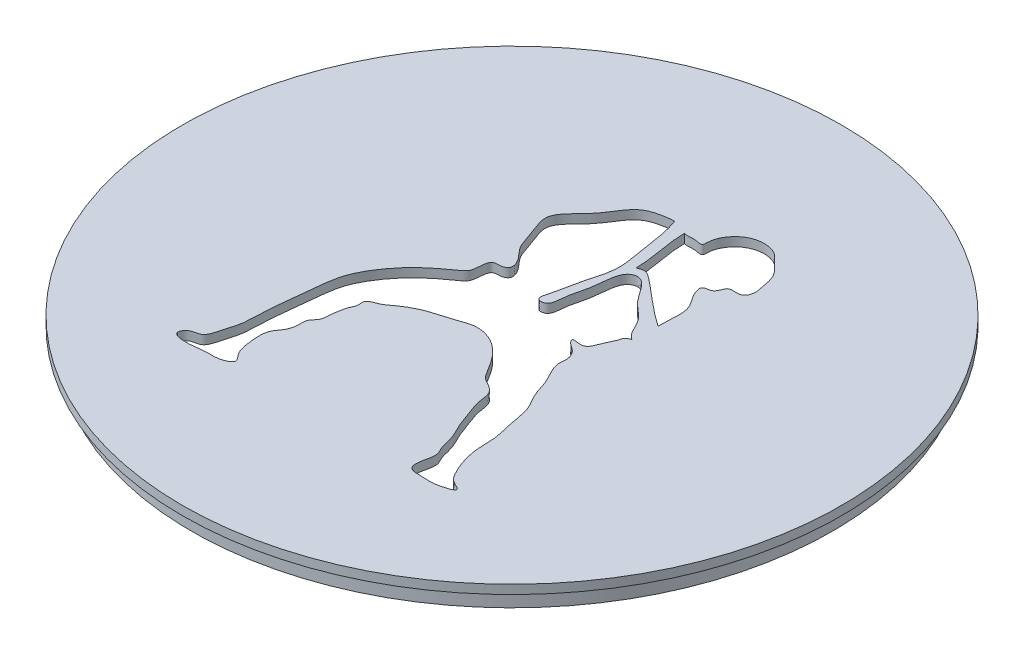
ISO-10303-21;
HEADER;
FILE_DESCRIPTION(('STEP AP214'),'2;1');
FILE_NAME('part.step','',(''),(''),'','','');
FILE_SCHEMA(('AUTOMOTIVE_DESIGN { 1 0 10303 214 1 1 1 1 }'));
ENDSEC;
DATA;
#1=APPLICATION_CONTEXT('core data for automotive mechanical design processes');
#2=APPLICATION_PROTOCOL_DEFINITION('international standard','automotive_design',2000,#1);
#3=PRODUCT_CONTEXT('',#1,'mechanical');
#4=PRODUCT('Part','Part','',(#3));
#5=PRODUCT_RELATED_PRODUCT_CATEGORY('part','',(#4));
#6=PRODUCT_DEFINITION_FORMATION('','',#4);
#7=PRODUCT_DEFINITION_CONTEXT('part definition',#1,'design');
#8=PRODUCT_DEFINITION('design','',#6,#7);
#9=PRODUCT_DEFINITION_SHAPE('','',#8);
#10=(LENGTH_UNIT() NAMED_UNIT(*) SI_UNIT(.MILLI.,.METRE.));
#11=(NAMED_UNIT(*) PLANE_ANGLE_UNIT() SI_UNIT($,.RADIAN.));
#12=(NAMED_UNIT(*) SI_UNIT($,.STERADIAN.) SOLID_ANGLE_UNIT());
#13=UNCERTAINTY_MEASURE_WITH_UNIT(LENGTH_MEASURE(1.E-05),#10,'distance_accuracy_value','');
#14=(GEOMETRIC_REPRESENTATION_CONTEXT(3) GLOBAL_UNCERTAINTY_ASSIGNED_CONTEXT((#13)) GLOBAL_UNIT_ASSIGNED_CONTEXT((#10,
#11,#12)) REPRESENTATION_CONTEXT('',''));
#15=CARTESIAN_POINT('',(0.,0.,0.));
#16=DIRECTION('',(0.,0.,1.));
#17=DIRECTION('',(1.,0.,0.));
#18=AXIS2_PLACEMENT_3D('',#15,#16,#17);
#19=CARTESIAN_POINT('',(35.,1.,-20.));
#20=DIRECTION('',(0.,-1.,0.));
#21=DIRECTION('',(0.,0.,-1.));
#22=AXIS2_PLACEMENT_3D('',#19,#20,#21);
#23=CYLINDRICAL_SURFACE('',#22,36.);
#24=CARTESIAN_POINT('',(35.,-2.,-20.));
#25=DIRECTION('',(0.,-1.,0.));
#26=DIRECTION('',(0.,0.,-1.));
#27=AXIS2_PLACEMENT_3D('',#24,#25,#26);
#28=CIRCLE('',#27,36.);
#29=CARTESIAN_POINT('',(35.,-2.,-56.));
#30=VERTEX_POINT('',#29);
#31=EDGE_CURVE('E93',#30,#30,#28,.T.);
#32=ORIENTED_EDGE('',*,*,#31,.F.);
#33=EDGE_LOOP('',(#32));
#34=FACE_BOUND('',#33,.T.);
#35=CARTESIAN_POINT('',(35.,0.,-20.));
#36=DIRECTION('',(0.,1.,0.));
#37=DIRECTION('',(0.,0.,1.));
#38=AXIS2_PLACEMENT_3D('',#35,#36,#37);
#39=CIRCLE('',#38,36.);
#40=CARTESIAN_POINT('',(35.,0.,16.));
#41=VERTEX_POINT('',#40);
#42=EDGE_CURVE('E11',#41,#41,#39,.T.);
#43=ORIENTED_EDGE('',*,*,#42,.F.);
#44=EDGE_LOOP('',(#43));
#45=FACE_BOUND('',#44,.T.);
#46=ADVANCED_FACE('F35',(#34,#45),#23,.T.);
#47=CARTESIAN_POINT('',(35.,0.,-20.));
#48=DIRECTION('',(0.,1.,0.));
#49=DIRECTION('',(0.,0.,1.));
#50=AXIS2_PLACEMENT_3D('',#47,#48,#49);
#51=PLANE('',#50);
#52=CARTESIAN_POINT('',(44.2684072218686,0.,-27.1376014509955));
#53=CARTESIAN_POINT('',(44.2533769701957,0.,-27.6533519739044));
#54=CARTESIAN_POINT('',(44.3415637822478,0.,-28.7380162958994));
#55=CARTESIAN_POINT('',(44.4370811389919,0.,-30.9929328559348));
#56=CARTESIAN_POINT('',(42.9768584395822,0.,-32.1663643897987));
#57=CARTESIAN_POINT('',(42.9123408622872,0.,-33.5384047598478));
#58=CARTESIAN_POINT('',(44.2570168843235,0.,-33.3685469718652));
#59=CARTESIAN_POINT('',(44.2788687764199,0.,-35.1618264145851));
#60=CARTESIAN_POINT('',(45.9428006665968,0.,-34.4996261485528));
#61=CARTESIAN_POINT('',(46.5366860307992,0.,-35.6809966284192));
#62=CARTESIAN_POINT('',(46.2732941288031,0.,-36.9630414381732));
#63=CARTESIAN_POINT('',(46.0009314383179,0.,-38.6354170478291));
#64=CARTESIAN_POINT('',(44.6920497916428,0.,-39.7356057286105));
#65=CARTESIAN_POINT('',(43.7915964612231,0.,-40.7944896880015));
#66=CARTESIAN_POINT('',(42.469955820955,0.,-41.2245196729233));
#67=CARTESIAN_POINT('',(41.0652192784521,0.,-41.0523551347629));
#68=CARTESIAN_POINT('',(39.8525616952295,0.,-40.2615959707708));
#69=CARTESIAN_POINT('',(39.1045097974421,0.,-39.1859639615422));
#70=CARTESIAN_POINT('',(38.8703827389554,0.,-38.3108620931466));
#71=CARTESIAN_POINT('',(38.9015647635665,0.,-37.3479483528773));
#72=CARTESIAN_POINT('',(37.8450244902051,0.,-37.7193780081381));
#73=CARTESIAN_POINT('',(37.1944804353436,0.,-37.5254301971895));
#74=CARTESIAN_POINT('',(36.8014674497458,0.,-37.6257686488056));
#75=CARTESIAN_POINT('',(36.7199381701414,0.,-37.6530722560517));
#76=B_SPLINE_CURVE_WITH_KNOTS('',3,(#52,#53,#54,#55,#56,#57,#58,#59,#60,#61,#62,#63,#64,#65,#66,
#67,#68,#69,#70,#71,#72,#73,#74,#75),.UNSPECIFIED.,.F.,.F.,(4,1,1,1,1,1,1,1,1,1,1,1,1,1,1,1,1,1,
1,1,1,4),(0.840261754562799,0.849614040426403,0.861989671805604,0.878687232952782,
0.879473272569278,0.885978907979521,0.893394390890591,0.902120846806361,0.907245198164805,
0.913938084328921,0.926247826115465,0.936822907601905,0.944331540495545,0.951416805850099,
0.96131279176228,0.969270836344137,0.977449048781423,0.984312844651854,0.986958297295132,
0.992067554802354,0.99835587173432,1.),.UNSPECIFIED.);
#77=CARTESIAN_POINT('',(44.2684072218686,0.,-27.1376014509955));
#78=VERTEX_POINT('',#77);
#79=CARTESIAN_POINT('',(36.7199381701414,0.,-37.6530722560517));
#80=VERTEX_POINT('',#79);
#81=EDGE_CURVE('E56',#78,#80,#76,.T.);
#82=ORIENTED_EDGE('',*,*,#81,.T.);
#83=CARTESIAN_POINT('',(36.7199381701414,0.,-37.6530722560517));
#84=CARTESIAN_POINT('',(36.7245709126911,0.,-35.4361929853331));
#85=CARTESIAN_POINT('',(37.3433949697957,0.,-33.9976339010875));
#86=CARTESIAN_POINT('',(37.3550791635603,0.,-31.5045272164468));
#87=CARTESIAN_POINT('',(37.85586392814,0.,-31.7858702006797));
#88=CARTESIAN_POINT('',(38.4397297089836,0.,-31.7648658024603));
#89=CARTESIAN_POINT('',(40.731795504975,0.,-29.9944883618215));
#90=CARTESIAN_POINT('',(42.3359800038837,0.,-28.4281882980386));
#91=CARTESIAN_POINT('',(44.2684072218686,0.,-27.1376014509955));
#92=B_SPLINE_CURVE_WITH_KNOTS('',3,(#83,#84,#85,#86,#87,#88,#89,#90,#91),.UNSPECIFIED.,.F.,.F.,
(4,1,1,1,1,1,4),(0.,0.408865467639292,0.417464776452159,0.441782685144361,0.484003627124166,
0.550110082068347,1.),.UNSPECIFIED.);
#93=EDGE_CURVE('E86',#80,#78,#92,.T.);
#94=ORIENTED_EDGE('',*,*,#93,.T.);
#95=EDGE_LOOP('',(#82,#94));
#96=FACE_BOUND('',#95,.T.);
#97=CARTESIAN_POINT('',(44.0945959688621,0.,-24.3747686748754));
#98=CARTESIAN_POINT('',(43.3402264316341,0.,-24.8219146313867));
#99=CARTESIAN_POINT('',(42.8794242997523,0.,-26.828060943173));
#100=CARTESIAN_POINT('',(40.3546147528533,0.,-28.1900739778941));
#101=CARTESIAN_POINT('',(39.089150894384,0.,-31.1742506440504));
#102=CARTESIAN_POINT('',(37.2865826762138,0.,-30.5025540707934));
#103=CARTESIAN_POINT('',(36.846057786281,0.,-28.9964151471788));
#104=CARTESIAN_POINT('',(36.8129174531688,0.,-26.9101642734574));
#105=CARTESIAN_POINT('',(36.1036963682116,0.,-25.0781606593259));
#106=CARTESIAN_POINT('',(36.1408081025084,0.,-22.9697175094246));
#107=CARTESIAN_POINT('',(34.6218540116167,0.,-22.916936972865));
#108=CARTESIAN_POINT('',(35.2499001639661,0.,-24.991471057335));
#109=CARTESIAN_POINT('',(35.5039554421292,0.,-27.1203239818772));
#110=CARTESIAN_POINT('',(36.6185353668157,0.,-30.1109769767712));
#111=CARTESIAN_POINT('',(35.8542596510925,0.,-33.9204569310826));
#112=CARTESIAN_POINT('',(35.646586984183,0.,-36.4947854128516));
#113=CARTESIAN_POINT('',(35.000000000006,0.,-38.2587399010213));
#114=B_SPLINE_CURVE_WITH_KNOTS('',3,(#97,#98,#99,#100,#101,#102,#103,#104,#105,#106,#107,#108,
#109,#110,#111,#112,#113),.UNSPECIFIED.,.F.,.F.,(4,1,1,1,1,1,1,1,1,1,1,1,1,1,4),(0.,
0.075653565265517,0.16329422090028,0.265408474211703,0.277383152405312,0.326761821228871,
0.388243326347542,0.467157234236005,0.516336115852378,0.534817749726603,0.570900710333995,
0.652929480321548,0.767428526514773,0.833043738036929,1.),.UNSPECIFIED.);
#115=CARTESIAN_POINT('',(44.0945959688621,0.,-24.3747686748754));
#116=VERTEX_POINT('',#115);
#117=CARTESIAN_POINT('',(35.000000000006,0.,-38.2587399010213));
#118=VERTEX_POINT('',#117);
#119=EDGE_CURVE('E126',#116,#118,#114,.T.);
#120=ORIENTED_EDGE('',*,*,#119,.T.);
#121=CARTESIAN_POINT('',(35.000000000006,0.,-38.2587399010213));
#122=CARTESIAN_POINT('',(34.6334103583951,0.,-38.2752923029345));
#123=CARTESIAN_POINT('',(33.648756906367,0.,-38.1295573479071));
#124=CARTESIAN_POINT('',(31.3040857680694,0.,-37.5388459223091));
#125=CARTESIAN_POINT('',(30.1168092688969,0.,-34.3356823666388));
#126=CARTESIAN_POINT('',(26.7641478812773,0.,-32.0070369936615));
#127=CARTESIAN_POINT('',(28.1551028871703,0.,-29.1290989436844));
#128=CARTESIAN_POINT('',(28.6711080022333,0.,-26.9260275864873));
#129=CARTESIAN_POINT('',(30.0293913679737,0.,-25.8493986237792));
#130=CARTESIAN_POINT('',(30.4315433907828,0.,-24.6148671822833));
#131=CARTESIAN_POINT('',(29.6974789151191,0.,-24.0406506953597));
#132=CARTESIAN_POINT('',(28.5878589531967,0.,-24.3063317553384));
#133=CARTESIAN_POINT('',(28.4125250510734,0.,-22.9719003172703));
#134=CARTESIAN_POINT('',(28.3998399106355,0.,-21.8818075734448));
#135=CARTESIAN_POINT('',(26.5228434376719,0.,-20.6029949131631));
#136=CARTESIAN_POINT('',(24.5961173362004,0.,-19.062333519027));
#137=CARTESIAN_POINT('',(22.8097129299006,0.,-16.6957572639246));
#138=CARTESIAN_POINT('',(21.5048500485635,0.,-14.2561700021504));
#139=CARTESIAN_POINT('',(21.2083673603225,0.,-10.6061532532267));
#140=CARTESIAN_POINT('',(20.7391210729927,0.,-7.25934436081872));
#141=CARTESIAN_POINT('',(20.7347679981921,0.,-4.86810811486501));
#142=CARTESIAN_POINT('',(20.580688090177,0.,-3.55055360393462));
#143=CARTESIAN_POINT('',(20.1334808303165,0.,-2.37115939707764));
#144=CARTESIAN_POINT('',(19.7677295689,0.,-0.471524993335283));
#145=CARTESIAN_POINT('',(18.3181570635214,0.,-0.587963471854365));
#146=CARTESIAN_POINT('',(17.5196591118911,0.,0.74708587412109));
#147=CARTESIAN_POINT('',(19.6799876776847,0.,1.06983585766343));
#148=CARTESIAN_POINT('',(21.2283417203665,0.,0.617763883262944));
#149=CARTESIAN_POINT('',(22.8241859250442,0.,0.854573911121346));
#150=CARTESIAN_POINT('',(24.2730653737471,0.,0.0435083743877694));
#151=CARTESIAN_POINT('',(23.1882123097544,0.,-0.968276034845709));
#152=CARTESIAN_POINT('',(22.9395017125131,0.,-2.19705456540007));
#153=CARTESIAN_POINT('',(22.7703002371806,0.,-3.5989998875785));
#154=CARTESIAN_POINT('',(22.8624733688003,0.,-4.92632394794915));
#155=CARTESIAN_POINT('',(23.7679535817603,0.,-5.87437036505003));
#156=CARTESIAN_POINT('',(24.0070936483419,0.,-6.97673916552015));
#157=CARTESIAN_POINT('',(23.8803953532202,0.,-8.08011903215776));
#158=CARTESIAN_POINT('',(24.8049662112702,0.,-8.77262340427504));
#159=CARTESIAN_POINT('',(24.7081291641603,0.,-9.96487245960174));
#160=CARTESIAN_POINT('',(24.9283486146205,0.,-10.8221740039716));
#161=CARTESIAN_POINT('',(25.0492370110219,0.,-11.6097466184251));
#162=CARTESIAN_POINT('',(25.5000157517144,0.,-12.1778815064506));
#163=CARTESIAN_POINT('',(25.1582963468325,0.,-13.2739339519208));
#164=CARTESIAN_POINT('',(26.5463756681205,0.,-13.5769471905162));
#165=CARTESIAN_POINT('',(27.6975313199085,0.,-14.5562087100063));
#166=CARTESIAN_POINT('',(29.6106864630498,0.,-15.6665111927504));
#167=CARTESIAN_POINT('',(31.8769497346245,0.,-16.1612360487609));
#168=CARTESIAN_POINT('',(33.779751425137,0.,-16.9574330121924));
#169=CARTESIAN_POINT('',(35.5585713484385,0.,-16.753562851689));
#170=CARTESIAN_POINT('',(37.2430979200246,0.,-15.767593916476));
#171=CARTESIAN_POINT('',(38.3849214634241,0.,-14.3125007306849));
#172=CARTESIAN_POINT('',(39.092400797911,0.,-13.0911013310902));
#173=CARTESIAN_POINT('',(39.6818316961198,0.,-12.2189743571604));
#174=CARTESIAN_POINT('',(40.5358620342724,0.,-11.8841742005808));
#175=CARTESIAN_POINT('',(41.4881113217759,0.,-11.0868510702231));
#176=CARTESIAN_POINT('',(41.4521641839507,0.,-9.61743324852769));
#177=CARTESIAN_POINT('',(42.1486098167388,0.,-8.1152379756008));
#178=CARTESIAN_POINT('',(42.6393221958368,0.,-6.37446575992144));
#179=CARTESIAN_POINT('',(43.6144604838174,0.,-4.8249813347122));
#180=CARTESIAN_POINT('',(43.7862517233169,0.,-3.34265073122424));
#181=CARTESIAN_POINT('',(44.5288338854425,0.,-2.12692196558256));
#182=CARTESIAN_POINT('',(44.048650315351,0.,-0.954303738814484));
#183=CARTESIAN_POINT('',(43.9937525050295,0.,0.795860267359707));
#184=CARTESIAN_POINT('',(45.8753560253886,0.,0.697141881002339));
#185=CARTESIAN_POINT('',(47.0220609593847,0.,0.898025913443454));
#186=CARTESIAN_POINT('',(49.5233883206855,0.,0.0919587022206106));
#187=CARTESIAN_POINT('',(47.8087624543954,0.,-0.46945567498224));
#188=CARTESIAN_POINT('',(47.1411710456176,0.,-1.46152557672172));
#189=CARTESIAN_POINT('',(46.4736206094042,0.,-2.95041370365713));
#190=CARTESIAN_POINT('',(45.9844959736973,0.,-4.88622300943797));
#191=CARTESIAN_POINT('',(46.1000321361512,0.,-7.09993219439433));
#192=CARTESIAN_POINT('',(45.38125872217,0.,-9.51548689862493));
#193=CARTESIAN_POINT('',(45.1607044707202,0.,-11.7784300300856));
#194=CARTESIAN_POINT('',(43.8776694352585,0.,-13.5823737353148));
#195=CARTESIAN_POINT('',(43.4996996922507,0.,-15.5132067410973));
#196=CARTESIAN_POINT('',(42.5302763924802,0.,-16.8477470700414));
#197=CARTESIAN_POINT('',(42.2526202926544,0.,-18.0366524337312));
#198=CARTESIAN_POINT('',(42.4960291373156,0.,-18.9403084643611));
#199=CARTESIAN_POINT('',(41.8851455209015,0.,-20.1104013563836));
#200=CARTESIAN_POINT('',(41.0352015397002,0.,-20.4225722705137));
#201=CARTESIAN_POINT('',(40.5805042436523,0.,-21.2424663322728));
#202=CARTESIAN_POINT('',(42.1781466815601,0.,-20.6639739461431));
#203=CARTESIAN_POINT('',(42.6572310391477,0.,-21.9008963847788));
#204=CARTESIAN_POINT('',(43.0112776119713,0.,-22.8055688452098));
#205=CARTESIAN_POINT('',(43.4042493033701,0.,-23.4715683537386));
#206=CARTESIAN_POINT('',(43.4739307960175,0.,-24.1735214405361));
#207=CARTESIAN_POINT('',(43.9372651647043,0.,-24.2794620400195));
#208=CARTESIAN_POINT('',(44.0945959688621,0.,-24.3747686748754));
#209=B_SPLINE_CURVE_WITH_KNOTS('',3,(#121,#122,#123,#124,#125,#126,#127,#128,#129,#130,#131,
#132,#133,#134,#135,#136,#137,#138,#139,#140,#141,#142,#143,#144,#145,#146,#147,#148,#149,#150,
#151,#152,#153,#154,#155,#156,#157,#158,#159,#160,#161,#162,#163,#164,#165,#166,#167,#168,#169,
#170,#171,#172,#173,#174,#175,#176,#177,#178,#179,#180,#181,#182,#183,#184,#185,#186,#187,#188,
#189,#190,#191,#192,#193,#194,#195,#196,#197,#198,#199,#200,#201,#202,#203,#204,#205,#206,#207,
#208),.UNSPECIFIED.,.F.,.F.,(4,1,1,1,1,1,1,1,1,1,1,1,1,1,1,1,1,1,1,1,1,1,1,1,1,1,1,1,1,1,1,1,1,
1,1,1,1,1,1,1,1,1,1,1,1,1,1,1,1,1,1,1,1,1,1,1,1,1,1,1,1,1,1,1,1,1,1,1,1,1,1,1,1,1,1,1,1,1,1,1,1,
1,1,1,1,4),(0.0111365318141637,0.0178945224331714,0.028840094658627,0.0535656406952058,
0.0763942975068769,0.0907824789208683,0.105824611112891,0.117198547687866,0.122579313700171,
0.125774424864193,0.132433961189153,0.138902274671442,0.145561810996402,0.152221347321363,
0.177469321740975,0.192360497662216,0.206081862640716,0.227670918744665,0.258486170551358,
0.268312899154322,0.271611104820945,0.282626245763527,0.293056087861728,0.300380672004226,
0.305512958211034,0.314184243058223,0.327371696046776,0.338888628983607,0.344534344162544,
0.349971310963932,0.35978828076642,0.368495546203212,0.375849975277582,0.383140358757306,
0.39148083635335,0.395962739615576,0.402399003646459,0.409753432720828,0.416280140492428,
0.41885768029041,0.424257140346201,0.428730315453577,0.436258060817448,0.443934884918196,
0.4580830691382,0.475465074628941,0.486740305280754,0.495169340304621,0.50730746498204,
0.521590357579405,0.528495312288299,0.533472975946526,0.540377930655419,0.544929056597164,
0.55530345416256,0.564763618049125,0.57546438064752,0.588352079637428,0.5976455315436,
0.602528071842045,0.613210558145976,0.620250037600372,0.628803340285457,0.639430809126769,
0.649602530831283,0.65545389054759,0.662581642785161,0.672715939123354,0.684786261536599,
0.699069154133964,0.712776808599336,0.73094908247305,0.739584236809564,0.752673529879548,
0.766303989723328,0.769155090618356,0.774753544475798,0.78293437890163,0.790233963276434,
0.791484253728353,0.7976412201643,0.805748850046419,0.812136353799026,0.816139236347283,
0.820033243830243,0.823536287348269),.UNSPECIFIED.);
#210=EDGE_CURVE('E134',#118,#116,#209,.T.);
#211=ORIENTED_EDGE('',*,*,#210,.T.);
#212=EDGE_LOOP('',(#120,#211));
#213=FACE_BOUND('',#212,.T.);
#214=CARTESIAN_POINT('',(35.,0.,-20.));
#215=DIRECTION('',(0.,-1.,0.));
#216=DIRECTION('',(0.,0.,-1.));
#217=AXIS2_PLACEMENT_3D('',#214,#215,#216);
#218=CIRCLE('',#217,35.);
#219=CARTESIAN_POINT('',(35.,0.,-55.));
#220=VERTEX_POINT('',#219);
#221=EDGE_CURVE('E180',#220,#220,#218,.T.);
#222=ORIENTED_EDGE('',*,*,#221,.T.);
#223=EDGE_LOOP('',(#222));
#224=FACE_BOUND('',#223,.T.);
#225=ADVANCED_FACE('F153',(#96,#213,#224),#51,.F.);
#226=CARTESIAN_POINT('',(35.,1.,-20.));
#227=DIRECTION('',(0.,1.,0.));
#228=DIRECTION('',(0.,0.,1.));
#229=AXIS2_PLACEMENT_3D('',#226,#227,#228);
#230=PLANE('',#229);
#231=CARTESIAN_POINT('',(35.000000000006,1.,-38.2587399010213));
#232=CARTESIAN_POINT('',(34.6334103583951,1.,-38.2752923029345));
#233=CARTESIAN_POINT('',(33.648756906367,1.,-38.1295573479071));
#234=CARTESIAN_POINT('',(31.3040857680694,1.,-37.5388459223091));
#235=CARTESIAN_POINT('',(30.1168092688969,1.,-34.3356823666388));
#236=CARTESIAN_POINT('',(26.7641478812773,1.,-32.0070369936615));
#237=CARTESIAN_POINT('',(28.1551028871703,1.,-29.1290989436844));
#238=CARTESIAN_POINT('',(28.6711080022333,1.,-26.9260275864873));
#239=CARTESIAN_POINT('',(30.0293913679737,1.,-25.8493986237792));
#240=CARTESIAN_POINT('',(30.4315433907828,1.,-24.6148671822833));
#241=CARTESIAN_POINT('',(29.6974789151191,1.,-24.0406506953597));
#242=CARTESIAN_POINT('',(28.5878589531967,1.,-24.3063317553384));
#243=CARTESIAN_POINT('',(28.4125250510734,1.,-22.9719003172703));
#244=CARTESIAN_POINT('',(28.3998399106355,1.,-21.8818075734448));
#245=CARTESIAN_POINT('',(26.5228434376719,1.,-20.6029949131631));
#246=CARTESIAN_POINT('',(24.5961173362004,1.,-19.062333519027));
#247=CARTESIAN_POINT('',(22.8097129299006,1.,-16.6957572639246));
#248=CARTESIAN_POINT('',(21.5048500485635,1.,-14.2561700021504));
#249=CARTESIAN_POINT('',(21.2083673603225,1.,-10.6061532532267));
#250=CARTESIAN_POINT('',(20.7391210729927,1.,-7.25934436081872));
#251=CARTESIAN_POINT('',(20.7347679981921,1.,-4.86810811486501));
#252=CARTESIAN_POINT('',(20.580688090177,1.,-3.55055360393462));
#253=CARTESIAN_POINT('',(20.1334808303165,1.,-2.37115939707764));
#254=CARTESIAN_POINT('',(19.7677295689,1.,-0.471524993335283));
#255=CARTESIAN_POINT('',(18.3181570635214,1.,-0.587963471854365));
#256=CARTESIAN_POINT('',(17.5196591118911,1.,0.74708587412109));
#257=CARTESIAN_POINT('',(19.6799876776847,1.,1.06983585766343));
#258=CARTESIAN_POINT('',(21.2283417203665,1.,0.617763883262944));
#259=CARTESIAN_POINT('',(22.8241859250442,1.,0.854573911121346));
#260=CARTESIAN_POINT('',(24.2730653737471,1.,0.0435083743877694));
#261=CARTESIAN_POINT('',(23.1882123097544,1.,-0.968276034845709));
#262=CARTESIAN_POINT('',(22.9395017125131,1.,-2.19705456540007));
#263=CARTESIAN_POINT('',(22.7703002371806,1.,-3.5989998875785));
#264=CARTESIAN_POINT('',(22.8624733688003,1.,-4.92632394794915));
#265=CARTESIAN_POINT('',(23.7679535817603,1.,-5.87437036505003));
#266=CARTESIAN_POINT('',(24.0070936483419,1.,-6.97673916552015));
#267=CARTESIAN_POINT('',(23.8803953532202,1.,-8.08011903215776));
#268=CARTESIAN_POINT('',(24.8049662112702,1.,-8.77262340427504));
#269=CARTESIAN_POINT('',(24.7081291641603,1.,-9.96487245960174));
#270=CARTESIAN_POINT('',(24.9283486146205,1.,-10.8221740039716));
#271=CARTESIAN_POINT('',(25.0492370110219,1.,-11.6097466184251));
#272=CARTESIAN_POINT('',(25.5000157517144,1.,-12.1778815064506));
#273=CARTESIAN_POINT('',(25.1582963468325,1.,-13.2739339519208));
#274=CARTESIAN_POINT('',(26.5463756681205,1.,-13.5769471905162));
#275=CARTESIAN_POINT('',(27.6975313199085,1.,-14.5562087100063));
#276=CARTESIAN_POINT('',(29.6106864630498,1.,-15.6665111927504));
#277=CARTESIAN_POINT('',(31.8769497346245,1.,-16.1612360487609));
#278=CARTESIAN_POINT('',(33.779751425137,1.,-16.9574330121924));
#279=CARTESIAN_POINT('',(35.5585713484385,1.,-16.753562851689));
#280=CARTESIAN_POINT('',(37.2430979200246,1.,-15.767593916476));
#281=CARTESIAN_POINT('',(38.3849214634241,1.,-14.3125007306849));
#282=CARTESIAN_POINT('',(39.092400797911,1.,-13.0911013310902));
#283=CARTESIAN_POINT('',(39.6818316961198,1.,-12.2189743571604));
#284=CARTESIAN_POINT('',(40.5358620342724,1.,-11.8841742005808));
#285=CARTESIAN_POINT('',(41.4881113217759,1.,-11.0868510702231));
#286=CARTESIAN_POINT('',(41.4521641839507,1.,-9.61743324852769));
#287=CARTESIAN_POINT('',(42.1486098167388,1.,-8.1152379756008));
#288=CARTESIAN_POINT('',(42.6393221958368,1.,-6.37446575992144));
#289=CARTESIAN_POINT('',(43.6144604838174,1.,-4.8249813347122));
#290=CARTESIAN_POINT('',(43.7862517233169,1.,-3.34265073122424));
#291=CARTESIAN_POINT('',(44.5288338854425,1.,-2.12692196558256));
#292=CARTESIAN_POINT('',(44.048650315351,1.,-0.954303738814484));
#293=CARTESIAN_POINT('',(43.9937525050295,1.,0.795860267359707));
#294=CARTESIAN_POINT('',(45.8753560253886,1.,0.697141881002339));
#295=CARTESIAN_POINT('',(47.0220609593847,1.,0.898025913443454));
#296=CARTESIAN_POINT('',(49.5233883206855,1.,0.0919587022206106));
#297=CARTESIAN_POINT('',(47.8087624543954,1.,-0.46945567498224));
#298=CARTESIAN_POINT('',(47.1411710456176,1.,-1.46152557672172));
#299=CARTESIAN_POINT('',(46.4736206094042,1.,-2.95041370365713));
#300=CARTESIAN_POINT('',(45.9844959736973,1.,-4.88622300943797));
#301=CARTESIAN_POINT('',(46.1000321361512,1.,-7.09993219439433));
#302=CARTESIAN_POINT('',(45.38125872217,1.,-9.51548689862493));
#303=CARTESIAN_POINT('',(45.1607044707202,1.,-11.7784300300856));
#304=CARTESIAN_POINT('',(43.8776694352585,1.,-13.5823737353148));
#305=CARTESIAN_POINT('',(43.4996996922507,1.,-15.5132067410973));
#306=CARTESIAN_POINT('',(42.5302763924802,1.,-16.8477470700414));
#307=CARTESIAN_POINT('',(42.2526202926544,1.,-18.0366524337312));
#308=CARTESIAN_POINT('',(42.4960291373156,1.,-18.9403084643611));
#309=CARTESIAN_POINT('',(41.8851455209015,1.,-20.1104013563836));
#310=CARTESIAN_POINT('',(41.0352015397002,1.,-20.4225722705137));
#311=CARTESIAN_POINT('',(40.5805042436523,1.,-21.2424663322728));
#312=CARTESIAN_POINT('',(42.1781466815601,1.,-20.6639739461431));
#313=CARTESIAN_POINT('',(42.6572310391477,1.,-21.9008963847788));
#314=CARTESIAN_POINT('',(43.0112776119713,1.,-22.8055688452098));
#315=CARTESIAN_POINT('',(43.4042493033701,1.,-23.4715683537386));
#316=CARTESIAN_POINT('',(43.4739307960175,1.,-24.1735214405361));
#317=CARTESIAN_POINT('',(43.9372651647043,1.,-24.2794620400195));
#318=CARTESIAN_POINT('',(44.0945959688621,1.,-24.3747686748754));
#319=B_SPLINE_CURVE_WITH_KNOTS('',3,(#231,#232,#233,#234,#235,#236,#237,#238,#239,#240,#241,
#242,#243,#244,#245,#246,#247,#248,#249,#250,#251,#252,#253,#254,#255,#256,#257,#258,#259,#260,
#261,#262,#263,#264,#265,#266,#267,#268,#269,#270,#271,#272,#273,#274,#275,#276,#277,#278,#279,
#280,#281,#282,#283,#284,#285,#286,#287,#288,#289,#290,#291,#292,#293,#294,#295,#296,#297,#298,
#299,#300,#301,#302,#303,#304,#305,#306,#307,#308,#309,#310,#311,#312,#313,#314,#315,#316,#317,
#318),.UNSPECIFIED.,.F.,.F.,(4,1,1,1,1,1,1,1,1,1,1,1,1,1,1,1,1,1,1,1,1,1,1,1,1,1,1,1,1,1,1,1,1,
1,1,1,1,1,1,1,1,1,1,1,1,1,1,1,1,1,1,1,1,1,1,1,1,1,1,1,1,1,1,1,1,1,1,1,1,1,1,1,1,1,1,1,1,1,1,1,1,
1,1,1,1,4),(0.0111365318141637,0.0178945224331714,0.028840094658627,0.0535656406952058,
0.0763942975068769,0.0907824789208683,0.105824611112891,0.117198547687866,0.122579313700171,
0.125774424864193,0.132433961189153,0.138902274671442,0.145561810996402,0.152221347321363,
0.177469321740975,0.192360497662216,0.206081862640716,0.227670918744665,0.258486170551358,
0.268312899154322,0.271611104820945,0.282626245763527,0.293056087861728,0.300380672004226,
0.305512958211034,0.314184243058223,0.327371696046776,0.338888628983607,0.344534344162544,
0.349971310963932,0.35978828076642,0.368495546203212,0.375849975277582,0.383140358757306,
0.39148083635335,0.395962739615576,0.402399003646459,0.409753432720828,0.416280140492428,
0.41885768029041,0.424257140346201,0.428730315453577,0.436258060817448,0.443934884918196,
0.4580830691382,0.475465074628941,0.486740305280754,0.495169340304621,0.50730746498204,
0.521590357579405,0.528495312288299,0.533472975946526,0.540377930655419,0.544929056597164,
0.55530345416256,0.564763618049125,0.57546438064752,0.588352079637428,0.5976455315436,
0.602528071842045,0.613210558145976,0.620250037600372,0.628803340285457,0.639430809126769,
0.649602530831283,0.65545389054759,0.662581642785161,0.672715939123354,0.684786261536599,
0.699069154133964,0.712776808599336,0.73094908247305,0.739584236809564,0.752673529879548,
0.766303989723328,0.769155090618356,0.774753544475798,0.78293437890163,0.790233963276434,
0.791484253728353,0.7976412201643,0.805748850046419,0.812136353799026,0.816139236347283,
0.820033243830243,0.823536287348269),.UNSPECIFIED.);
#320=CARTESIAN_POINT('',(35.000000000006,1.,-38.2587399010213));
#321=VERTEX_POINT('',#320);
#322=CARTESIAN_POINT('',(44.0945959688621,1.,-24.3747686748754));
#323=VERTEX_POINT('',#322);
#324=EDGE_CURVE('E115',#321,#323,#319,.T.);
#325=ORIENTED_EDGE('',*,*,#324,.F.);
#326=CARTESIAN_POINT('',(44.0945959688621,1.,-24.3747686748754));
#327=CARTESIAN_POINT('',(43.3402264316341,1.,-24.8219146313867));
#328=CARTESIAN_POINT('',(42.8794242997523,1.,-26.828060943173));
#329=CARTESIAN_POINT('',(40.3546147528533,1.,-28.1900739778941));
#330=CARTESIAN_POINT('',(39.089150894384,1.,-31.1742506440504));
#331=CARTESIAN_POINT('',(37.2865826762138,1.,-30.5025540707934));
#332=CARTESIAN_POINT('',(36.846057786281,1.,-28.9964151471788));
#333=CARTESIAN_POINT('',(36.8129174531688,1.,-26.9101642734574));
#334=CARTESIAN_POINT('',(36.1036963682116,1.,-25.0781606593259));
#335=CARTESIAN_POINT('',(36.1408081025084,1.,-22.9697175094246));
#336=CARTESIAN_POINT('',(34.6218540116167,1.,-22.916936972865));
#337=CARTESIAN_POINT('',(35.2499001639661,1.,-24.991471057335));
#338=CARTESIAN_POINT('',(35.5039554421292,1.,-27.1203239818772));
#339=CARTESIAN_POINT('',(36.6185353668157,1.,-30.1109769767712));
#340=CARTESIAN_POINT('',(35.8542596510925,1.,-33.9204569310826));
#341=CARTESIAN_POINT('',(35.646586984183,1.,-36.4947854128516));
#342=CARTESIAN_POINT('',(35.000000000006,1.,-38.2587399010213));
#343=B_SPLINE_CURVE_WITH_KNOTS('',3,(#326,#327,#328,#329,#330,#331,#332,#333,#334,#335,#336,
#337,#338,#339,#340,#341,#342),.UNSPECIFIED.,.F.,.F.,(4,1,1,1,1,1,1,1,1,1,1,1,1,1,4),(0.,
0.075653565265517,0.16329422090028,0.265408474211703,0.277383152405312,0.326761821228871,
0.388243326347542,0.467157234236005,0.516336115852378,0.534817749726603,0.570900710333995,
0.652929480321548,0.767428526514773,0.833043738036929,1.),.UNSPECIFIED.);
#344=EDGE_CURVE('E121',#323,#321,#343,.T.);
#345=ORIENTED_EDGE('',*,*,#344,.F.);
#346=EDGE_LOOP('',(#325,#345));
#347=FACE_BOUND('',#346,.T.);
#348=CARTESIAN_POINT('',(36.7199381701414,1.,-37.6530722560517));
#349=CARTESIAN_POINT('',(36.7245709126911,1.,-35.4361929853331));
#350=CARTESIAN_POINT('',(37.3433949697957,1.,-33.9976339010875));
#351=CARTESIAN_POINT('',(37.3550791635603,1.,-31.5045272164468));
#352=CARTESIAN_POINT('',(37.85586392814,1.,-31.7858702006797));
#353=CARTESIAN_POINT('',(38.4397297089836,1.,-31.7648658024603));
#354=CARTESIAN_POINT('',(40.731795504975,1.,-29.9944883618215));
#355=CARTESIAN_POINT('',(42.3359800038837,1.,-28.4281882980386));
#356=CARTESIAN_POINT('',(44.2684072218686,1.,-27.1376014509955));
#357=B_SPLINE_CURVE_WITH_KNOTS('',3,(#348,#349,#350,#351,#352,#353,#354,#355,#356),
.UNSPECIFIED.,.F.,.F.,(4,1,1,1,1,1,4),(0.,0.408865467639292,0.417464776452159,0.441782685144361,
0.484003627124166,0.550110082068347,1.),.UNSPECIFIED.);
#358=CARTESIAN_POINT('',(36.7199381701414,1.,-37.6530722560517));
#359=VERTEX_POINT('',#358);
#360=CARTESIAN_POINT('',(44.2684072218686,1.,-27.1376014509955));
#361=VERTEX_POINT('',#360);
#362=EDGE_CURVE('E74',#359,#361,#357,.T.);
#363=ORIENTED_EDGE('',*,*,#362,.F.);
#364=CARTESIAN_POINT('',(44.2684072218686,1.,-27.1376014509955));
#365=CARTESIAN_POINT('',(44.2533769701957,1.,-27.6533519739044));
#366=CARTESIAN_POINT('',(44.3415637822478,1.,-28.7380162958994));
#367=CARTESIAN_POINT('',(44.4370811389919,1.,-30.9929328559348));
#368=CARTESIAN_POINT('',(42.9768584395822,1.,-32.1663643897987));
#369=CARTESIAN_POINT('',(42.9123408622872,1.,-33.5384047598478));
#370=CARTESIAN_POINT('',(44.2570168843235,1.,-33.3685469718652));
#371=CARTESIAN_POINT('',(44.2788687764199,1.,-35.1618264145851));
#372=CARTESIAN_POINT('',(45.9428006665968,1.,-34.4996261485528));
#373=CARTESIAN_POINT('',(46.5366860307992,1.,-35.6809966284192));
#374=CARTESIAN_POINT('',(46.2732941288031,1.,-36.9630414381732));
#375=CARTESIAN_POINT('',(46.0009314383179,1.,-38.6354170478291));
#376=CARTESIAN_POINT('',(44.6920497916428,1.,-39.7356057286105));
#377=CARTESIAN_POINT('',(43.7915964612231,1.,-40.7944896880015));
#378=CARTESIAN_POINT('',(42.469955820955,1.,-41.2245196729233));
#379=CARTESIAN_POINT('',(41.0652192784521,1.,-41.0523551347629));
#380=CARTESIAN_POINT('',(39.8525616952295,1.,-40.2615959707708));
#381=CARTESIAN_POINT('',(39.1045097974421,1.,-39.1859639615422));
#382=CARTESIAN_POINT('',(38.8703827389554,1.,-38.3108620931466));
#383=CARTESIAN_POINT('',(38.9015647635665,1.,-37.3479483528773));
#384=CARTESIAN_POINT('',(37.8450244902051,1.,-37.7193780081381));
#385=CARTESIAN_POINT('',(37.1944804353436,1.,-37.5254301971895));
#386=CARTESIAN_POINT('',(36.8014674497458,1.,-37.6257686488056));
#387=CARTESIAN_POINT('',(36.7199381701414,1.,-37.6530722560517));
#388=B_SPLINE_CURVE_WITH_KNOTS('',3,(#364,#365,#366,#367,#368,#369,#370,#371,#372,#373,#374,
#375,#376,#377,#378,#379,#380,#381,#382,#383,#384,#385,#386,#387),.UNSPECIFIED.,.F.,.F.,(4,1,1,
1,1,1,1,1,1,1,1,1,1,1,1,1,1,1,1,1,1,4),(0.840261754562799,0.849614040426403,0.861989671805604,
0.878687232952782,0.879473272569278,0.885978907979521,0.893394390890591,0.902120846806361,
0.907245198164805,0.913938084328921,0.926247826115465,0.936822907601905,0.944331540495545,
0.951416805850099,0.96131279176228,0.969270836344137,0.977449048781423,0.984312844651854,
0.986958297295132,0.992067554802354,0.99835587173432,1.),.UNSPECIFIED.);
#389=EDGE_CURVE('E80',#361,#359,#388,.T.);
#390=ORIENTED_EDGE('',*,*,#389,.F.);
#391=EDGE_LOOP('',(#363,#390));
#392=FACE_BOUND('',#391,.T.);
#393=CARTESIAN_POINT('',(35.,1.,-20.));
#394=DIRECTION('',(0.,1.,0.));
#395=DIRECTION('',(0.,0.,1.));
#396=AXIS2_PLACEMENT_3D('',#393,#394,#395);
#397=CIRCLE('',#396,37.);
#398=CARTESIAN_POINT('',(35.,1.,17.));
#399=VERTEX_POINT('',#398);
#400=EDGE_CURVE('E181',#399,#399,#397,.T.);
#401=ORIENTED_EDGE('',*,*,#400,.T.);
#402=EDGE_LOOP('',(#401));
#403=FACE_BOUND('',#402,.T.);
#404=ADVANCED_FACE('F84',(#347,#392,#403),#230,.T.);
#405=DIRECTION('',(0.,-1.,0.));
#406=VECTOR('',#405,1.);
#407=SURFACE_OF_LINEAR_EXTRUSION('',#343,#406);
#408=ORIENTED_EDGE('',*,*,#119,.F.);
#409=DIRECTION('',(0.,-1.,0.));
#410=VECTOR('',#409,1.);
#411=CARTESIAN_POINT('',(44.0945959688621,1.,-24.3747686748754));
#412=LINE('',#411,#410);
#413=EDGE_CURVE('E120',#323,#116,#412,.T.);
#414=ORIENTED_EDGE('',*,*,#413,.F.);
#415=ORIENTED_EDGE('',*,*,#344,.T.);
#416=DIRECTION('',(0.,-1.,0.));
#417=VECTOR('',#416,1.);
#418=CARTESIAN_POINT('',(35.000000000006,1.,-38.2587399010213));
#419=LINE('',#418,#417);
#420=EDGE_CURVE('E42',#321,#118,#419,.T.);
#421=ORIENTED_EDGE('',*,*,#420,.T.);
#422=EDGE_LOOP('',(#408,#414,#415,#421));
#423=FACE_BOUND('',#422,.T.);
#424=ADVANCED_FACE('F111',(#423),#407,.T.);
#425=DIRECTION('',(0.,-1.,0.));
#426=VECTOR('',#425,1.);
#427=SURFACE_OF_LINEAR_EXTRUSION('',#319,#426);
#428=ORIENTED_EDGE('',*,*,#210,.F.);
#429=ORIENTED_EDGE('',*,*,#420,.F.);
#430=ORIENTED_EDGE('',*,*,#324,.T.);
#431=ORIENTED_EDGE('',*,*,#413,.T.);
#432=EDGE_LOOP('',(#428,#429,#430,#431));
#433=FACE_BOUND('',#432,.T.);
#434=ADVANCED_FACE('F106',(#433),#427,.T.);
#435=DIRECTION('',(0.,-1.,0.));
#436=VECTOR('',#435,1.);
#437=SURFACE_OF_LINEAR_EXTRUSION('',#388,#436);
#438=ORIENTED_EDGE('',*,*,#81,.F.);
#439=DIRECTION('',(0.,-1.,0.));
#440=VECTOR('',#439,1.);
#441=CARTESIAN_POINT('',(44.2684072218686,1.,-27.1376014509955));
#442=LINE('',#441,#440);
#443=EDGE_CURVE('E76',#361,#78,#442,.T.);
#444=ORIENTED_EDGE('',*,*,#443,.F.);
#445=ORIENTED_EDGE('',*,*,#389,.T.);
#446=DIRECTION('',(0.,-1.,0.));
#447=VECTOR('',#446,1.);
#448=CARTESIAN_POINT('',(36.7199381701414,1.,-37.6530722560517));
#449=LINE('',#448,#447);
#450=EDGE_CURVE('E49',#359,#80,#449,.T.);
#451=ORIENTED_EDGE('',*,*,#450,.T.);
#452=EDGE_LOOP('',(#438,#444,#445,#451));
#453=FACE_BOUND('',#452,.T.);
#454=ADVANCED_FACE('F82',(#453),#437,.T.);
#455=DIRECTION('',(0.,-1.,0.));
#456=VECTOR('',#455,1.);
#457=SURFACE_OF_LINEAR_EXTRUSION('',#357,#456);
#458=ORIENTED_EDGE('',*,*,#93,.F.);
#459=ORIENTED_EDGE('',*,*,#450,.F.);
#460=ORIENTED_EDGE('',*,*,#362,.T.);
#461=ORIENTED_EDGE('',*,*,#443,.T.);
#462=EDGE_LOOP('',(#458,#459,#460,#461));
#463=FACE_BOUND('',#462,.T.);
#464=ADVANCED_FACE('F75',(#463),#457,.T.);
#465=CARTESIAN_POINT('',(35.,-2.,-20.));
#466=DIRECTION('',(0.,-1.,0.));
#467=DIRECTION('',(0.,0.,-1.));
#468=AXIS2_PLACEMENT_3D('',#465,#466,#467);
#469=PLANE('',#468);
#470=ORIENTED_EDGE('',*,*,#31,.T.);
#471=EDGE_LOOP('',(#470));
#472=FACE_BOUND('',#471,.T.);
#473=CARTESIAN_POINT('',(35.,-2.,-20.));
#474=DIRECTION('',(0.,-1.,0.));
#475=DIRECTION('',(0.,0.,-1.));
#476=AXIS2_PLACEMENT_3D('',#473,#474,#475);
#477=CIRCLE('',#476,35.);
#478=CARTESIAN_POINT('',(35.,-2.,-55.));
#479=VERTEX_POINT('',#478);
#480=EDGE_CURVE('E184',#479,#479,#477,.T.);
#481=ORIENTED_EDGE('',*,*,#480,.F.);
#482=EDGE_LOOP('',(#481));
#483=FACE_BOUND('',#482,.T.);
#484=ADVANCED_FACE('F202',(#472,#483),#469,.T.);
#485=CARTESIAN_POINT('',(35.,-2.,-20.));
#486=DIRECTION('',(0.,1.,0.));
#487=DIRECTION('',(0.,0.,1.));
#488=AXIS2_PLACEMENT_3D('',#485,#486,#487);
#489=CYLINDRICAL_SURFACE('',#488,35.);
#490=ORIENTED_EDGE('',*,*,#480,.T.);
#491=EDGE_LOOP('',(#490));
#492=FACE_BOUND('',#491,.T.);
#493=ORIENTED_EDGE('',*,*,#221,.F.);
#494=EDGE_LOOP('',(#493));
#495=FACE_BOUND('',#494,.T.);
#496=ADVANCED_FACE('F205',(#492,#495),#489,.F.);
#497=CARTESIAN_POINT('',(35.,0.,-20.));
#498=DIRECTION('',(0.,1.,0.));
#499=DIRECTION('',(0.,0.,1.));
#500=AXIS2_PLACEMENT_3D('',#497,#498,#499);
#501=CYLINDRICAL_SURFACE('',#500,37.);
#502=CARTESIAN_POINT('',(35.,0.,-20.));
#503=DIRECTION('',(0.,1.,0.));
#504=DIRECTION('',(0.,0.,1.));
#505=AXIS2_PLACEMENT_3D('',#502,#503,#504);
#506=CIRCLE('',#505,37.);
#507=CARTESIAN_POINT('',(35.,0.,17.));
#508=VERTEX_POINT('',#507);
#509=EDGE_CURVE('E178',#508,#508,#506,.T.);
#510=ORIENTED_EDGE('',*,*,#509,.T.);
#511=EDGE_LOOP('',(#510));
#512=FACE_BOUND('',#511,.T.);
#513=ORIENTED_EDGE('',*,*,#400,.F.);
#514=EDGE_LOOP('',(#513));
#515=FACE_BOUND('',#514,.T.);
#516=ADVANCED_FACE('F174',(#512,#515),#501,.T.);
#517=CARTESIAN_POINT('',(35.,0.,-20.));
#518=DIRECTION('',(0.,1.,0.));
#519=DIRECTION('',(0.,0.,1.));
#520=AXIS2_PLACEMENT_3D('',#517,#518,#519);
#521=PLANE('',#520);
#522=ORIENTED_EDGE('',*,*,#42,.T.);
#523=EDGE_LOOP('',(#522));
#524=FACE_BOUND('',#523,.T.);
#525=ORIENTED_EDGE('',*,*,#509,.F.);
#526=EDGE_LOOP('',(#525));
#527=FACE_BOUND('',#526,.T.);
#528=ADVANCED_FACE('F171',(#524,#527),#521,.F.);
#529=CLOSED_SHELL('',(#46,#225,#404,#424,#434,#454,#464,#484,#496,#516,#528));
#530=MANIFOLD_SOLID_BREP('B2',#529);
#531=ADVANCED_BREP_SHAPE_REPRESENTATION('',(#18,#530),#14);
#532=SHAPE_DEFINITION_REPRESENTATION(#9,#531);
ENDSEC;
END-ISO-10303-21;
